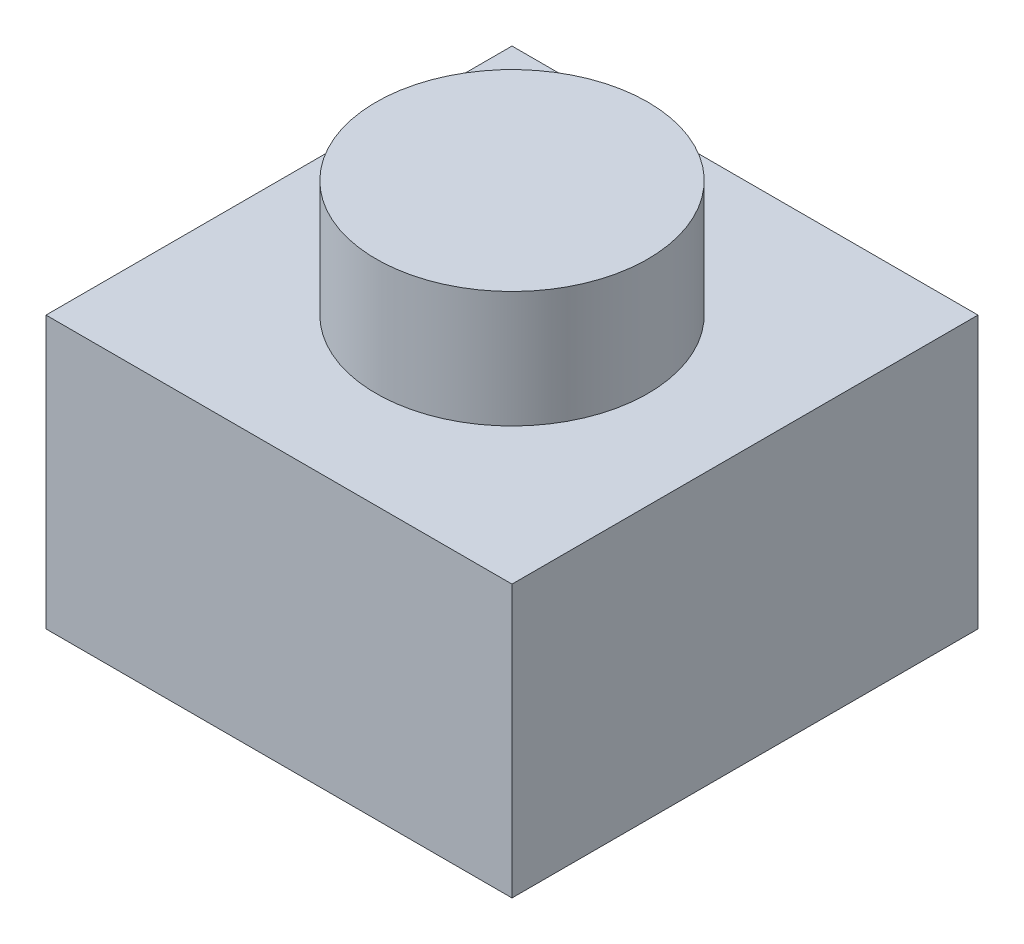
ISO-10303-21;
HEADER;
FILE_DESCRIPTION(('STEP AP214'),'2;1');
FILE_NAME('part.step','',(''),(''),'','','');
FILE_SCHEMA(('AUTOMOTIVE_DESIGN { 1 0 10303 214 1 1 1 1 }'));
ENDSEC;
DATA;
#1=APPLICATION_CONTEXT('core data for automotive mechanical design processes');
#2=APPLICATION_PROTOCOL_DEFINITION('international standard','automotive_design',2000,#1);
#3=PRODUCT_CONTEXT('',#1,'mechanical');
#4=PRODUCT('Part','Part','',(#3));
#5=PRODUCT_RELATED_PRODUCT_CATEGORY('part','',(#4));
#6=PRODUCT_DEFINITION_FORMATION('','',#4);
#7=PRODUCT_DEFINITION_CONTEXT('part definition',#1,'design');
#8=PRODUCT_DEFINITION('design','',#6,#7);
#9=PRODUCT_DEFINITION_SHAPE('','',#8);
#10=(LENGTH_UNIT() NAMED_UNIT(*) SI_UNIT(.MILLI.,.METRE.));
#11=(NAMED_UNIT(*) PLANE_ANGLE_UNIT() SI_UNIT($,.RADIAN.));
#12=(NAMED_UNIT(*) SI_UNIT($,.STERADIAN.) SOLID_ANGLE_UNIT());
#13=UNCERTAINTY_MEASURE_WITH_UNIT(LENGTH_MEASURE(1.E-05),#10,'distance_accuracy_value','');
#14=(GEOMETRIC_REPRESENTATION_CONTEXT(3) GLOBAL_UNCERTAINTY_ASSIGNED_CONTEXT((#13)) GLOBAL_UNIT_ASSIGNED_CONTEXT((#10,
#11,#12)) REPRESENTATION_CONTEXT('',''));
#15=CARTESIAN_POINT('',(0.,0.,0.));
#16=DIRECTION('',(0.,0.,1.));
#17=DIRECTION('',(1.,0.,0.));
#18=AXIS2_PLACEMENT_3D('',#15,#16,#17);
#19=CARTESIAN_POINT('',(0.,3.556,0.));
#20=DIRECTION('',(1.,0.,0.));
#21=DIRECTION('',(0.,0.,-1.));
#22=AXIS2_PLACEMENT_3D('',#19,#20,#21);
#23=PLANE('',#22);
#24=DIRECTION('',(0.,0.,1.));
#25=VECTOR('',#24,1.);
#26=CARTESIAN_POINT('',(0.,0.,0.));
#27=LINE('',#26,#25);
#28=CARTESIAN_POINT('',(0.,0.,-6.096));
#29=VERTEX_POINT('',#28);
#30=CARTESIAN_POINT('',(0.,0.,0.));
#31=VERTEX_POINT('',#30);
#32=EDGE_CURVE('E99',#29,#31,#27,.T.);
#33=ORIENTED_EDGE('',*,*,#32,.T.);
#34=DIRECTION('',(0.,-1.,0.));
#35=VECTOR('',#34,1.);
#36=CARTESIAN_POINT('',(0.,3.556,0.));
#37=LINE('',#36,#35);
#38=CARTESIAN_POINT('',(0.,3.556,0.));
#39=VERTEX_POINT('',#38);
#40=EDGE_CURVE('E36',#39,#31,#37,.T.);
#41=ORIENTED_EDGE('',*,*,#40,.F.);
#42=DIRECTION('',(0.,0.,1.));
#43=VECTOR('',#42,1.);
#44=CARTESIAN_POINT('',(0.,3.556,0.));
#45=LINE('',#44,#43);
#46=CARTESIAN_POINT('',(0.,3.556,-6.096));
#47=VERTEX_POINT('',#46);
#48=EDGE_CURVE('E86',#47,#39,#45,.T.);
#49=ORIENTED_EDGE('',*,*,#48,.F.);
#50=DIRECTION('',(0.,-1.,0.));
#51=VECTOR('',#50,1.);
#52=CARTESIAN_POINT('',(0.,3.556,-6.096));
#53=LINE('',#52,#51);
#54=EDGE_CURVE('E95',#47,#29,#53,.T.);
#55=ORIENTED_EDGE('',*,*,#54,.T.);
#56=EDGE_LOOP('',(#33,#41,#49,#55));
#57=FACE_BOUND('',#56,.T.);
#58=ADVANCED_FACE('F33',(#57),#23,.F.);
#59=CARTESIAN_POINT('',(0.,3.556,0.));
#60=DIRECTION('',(0.,0.,-1.));
#61=DIRECTION('',(-1.,0.,0.));
#62=AXIS2_PLACEMENT_3D('',#59,#60,#61);
#63=PLANE('',#62);
#64=DIRECTION('',(1.,0.,0.));
#65=VECTOR('',#64,1.);
#66=CARTESIAN_POINT('',(0.,0.,0.));
#67=LINE('',#66,#65);
#68=CARTESIAN_POINT('',(6.096,0.,0.));
#69=VERTEX_POINT('',#68);
#70=EDGE_CURVE('E91',#31,#69,#67,.T.);
#71=ORIENTED_EDGE('',*,*,#70,.T.);
#72=DIRECTION('',(0.,-1.,0.));
#73=VECTOR('',#72,1.);
#74=CARTESIAN_POINT('',(6.096,3.556,0.));
#75=LINE('',#74,#73);
#76=CARTESIAN_POINT('',(6.096,3.556,0.));
#77=VERTEX_POINT('',#76);
#78=EDGE_CURVE('E89',#77,#69,#75,.T.);
#79=ORIENTED_EDGE('',*,*,#78,.F.);
#80=DIRECTION('',(1.,0.,0.));
#81=VECTOR('',#80,1.);
#82=CARTESIAN_POINT('',(0.,3.556,0.));
#83=LINE('',#82,#81);
#84=EDGE_CURVE('E81',#39,#77,#83,.T.);
#85=ORIENTED_EDGE('',*,*,#84,.F.);
#86=ORIENTED_EDGE('',*,*,#40,.T.);
#87=EDGE_LOOP('',(#71,#79,#85,#86));
#88=FACE_BOUND('',#87,.T.);
#89=ADVANCED_FACE('F90',(#88),#63,.F.);
#90=CARTESIAN_POINT('',(6.096,3.556,0.));
#91=DIRECTION('',(-1.,0.,0.));
#92=DIRECTION('',(0.,0.,1.));
#93=AXIS2_PLACEMENT_3D('',#90,#91,#92);
#94=PLANE('',#93);
#95=DIRECTION('',(0.,0.,-1.));
#96=VECTOR('',#95,1.);
#97=CARTESIAN_POINT('',(6.096,0.,0.));
#98=LINE('',#97,#96);
#99=CARTESIAN_POINT('',(6.096,0.,-6.096));
#100=VERTEX_POINT('',#99);
#101=EDGE_CURVE('E67',#69,#100,#98,.T.);
#102=ORIENTED_EDGE('',*,*,#101,.T.);
#103=DIRECTION('',(0.,-1.,0.));
#104=VECTOR('',#103,1.);
#105=CARTESIAN_POINT('',(6.096,3.556,-6.096));
#106=LINE('',#105,#104);
#107=CARTESIAN_POINT('',(6.096,3.556,-6.096));
#108=VERTEX_POINT('',#107);
#109=EDGE_CURVE('E92',#108,#100,#106,.T.);
#110=ORIENTED_EDGE('',*,*,#109,.F.);
#111=DIRECTION('',(0.,0.,-1.));
#112=VECTOR('',#111,1.);
#113=CARTESIAN_POINT('',(6.096,3.556,0.));
#114=LINE('',#113,#112);
#115=EDGE_CURVE('E84',#77,#108,#114,.T.);
#116=ORIENTED_EDGE('',*,*,#115,.F.);
#117=ORIENTED_EDGE('',*,*,#78,.T.);
#118=EDGE_LOOP('',(#102,#110,#116,#117));
#119=FACE_BOUND('',#118,.T.);
#120=ADVANCED_FACE('F93',(#119),#94,.F.);
#121=CARTESIAN_POINT('',(0.,3.556,-6.096));
#122=DIRECTION('',(0.,0.,1.));
#123=DIRECTION('',(1.,0.,0.));
#124=AXIS2_PLACEMENT_3D('',#121,#122,#123);
#125=PLANE('',#124);
#126=DIRECTION('',(-1.,0.,0.));
#127=VECTOR('',#126,1.);
#128=CARTESIAN_POINT('',(0.,0.,-6.096));
#129=LINE('',#128,#127);
#130=EDGE_CURVE('E73',#100,#29,#129,.T.);
#131=ORIENTED_EDGE('',*,*,#130,.T.);
#132=ORIENTED_EDGE('',*,*,#54,.F.);
#133=DIRECTION('',(-1.,0.,0.));
#134=VECTOR('',#133,1.);
#135=CARTESIAN_POINT('',(0.,3.556,-6.096));
#136=LINE('',#135,#134);
#137=EDGE_CURVE('E50',#108,#47,#136,.T.);
#138=ORIENTED_EDGE('',*,*,#137,.F.);
#139=ORIENTED_EDGE('',*,*,#109,.T.);
#140=EDGE_LOOP('',(#131,#132,#138,#139));
#141=FACE_BOUND('',#140,.T.);
#142=ADVANCED_FACE('F107',(#141),#125,.F.);
#143=CARTESIAN_POINT('',(0.,3.556,0.));
#144=DIRECTION('',(0.,-1.,0.));
#145=DIRECTION('',(0.,0.,-1.));
#146=AXIS2_PLACEMENT_3D('',#143,#144,#145);
#147=PLANE('',#146);
#148=CARTESIAN_POINT('',(3.04800000000007,3.556,-3.048));
#149=DIRECTION('',(0.,1.,0.));
#150=DIRECTION('',(0.,0.,1.));
#151=AXIS2_PLACEMENT_3D('',#148,#149,#150);
#152=CIRCLE('',#151,1.778);
#153=CARTESIAN_POINT('',(3.04800000000007,3.556,-4.826));
#154=VERTEX_POINT('',#153);
#155=EDGE_CURVE('E11',#154,#154,#152,.T.);
#156=ORIENTED_EDGE('',*,*,#155,.F.);
#157=EDGE_LOOP('',(#156));
#158=FACE_BOUND('',#157,.T.);
#159=ORIENTED_EDGE('',*,*,#48,.T.);
#160=ORIENTED_EDGE('',*,*,#84,.T.);
#161=ORIENTED_EDGE('',*,*,#115,.T.);
#162=ORIENTED_EDGE('',*,*,#137,.T.);
#163=EDGE_LOOP('',(#159,#160,#161,#162));
#164=FACE_BOUND('',#163,.T.);
#165=ADVANCED_FACE('F82',(#158,#164),#147,.F.);
#166=CARTESIAN_POINT('',(0.,0.,0.));
#167=DIRECTION('',(0.,-1.,0.));
#168=DIRECTION('',(0.,0.,-1.));
#169=AXIS2_PLACEMENT_3D('',#166,#167,#168);
#170=PLANE('',#169);
#171=ORIENTED_EDGE('',*,*,#32,.F.);
#172=ORIENTED_EDGE('',*,*,#130,.F.);
#173=ORIENTED_EDGE('',*,*,#101,.F.);
#174=ORIENTED_EDGE('',*,*,#70,.F.);
#175=EDGE_LOOP('',(#171,#172,#173,#174));
#176=FACE_BOUND('',#175,.T.);
#177=ADVANCED_FACE('F110',(#176),#170,.T.);
#178=CARTESIAN_POINT('',(3.04800000000007,5.08,-3.048));
#179=DIRECTION('',(0.,-1.,0.));
#180=DIRECTION('',(0.,0.,-1.));
#181=AXIS2_PLACEMENT_3D('',#178,#179,#180);
#182=CYLINDRICAL_SURFACE('',#181,1.778);
#183=CARTESIAN_POINT('',(3.04800000000007,5.08,-3.048));
#184=DIRECTION('',(0.,1.,0.));
#185=DIRECTION('',(0.,0.,1.));
#186=AXIS2_PLACEMENT_3D('',#183,#184,#185);
#187=CIRCLE('',#186,1.778);
#188=CARTESIAN_POINT('',(3.04800000000007,5.08,-4.826));
#189=VERTEX_POINT('',#188);
#190=EDGE_CURVE('E102',#189,#189,#187,.T.);
#191=CARTESIAN_POINT('',(3.04800000000007,5.08,-4.826));
#192=CARTESIAN_POINT('',(3.04800000000007,5.064125,-4.826));
#193=CARTESIAN_POINT('',(3.04800000000007,5.04825,-4.826));
#194=CARTESIAN_POINT('',(3.04800000000007,5.0165,-4.826));
#195=CARTESIAN_POINT('',(3.04800000000007,5.000625,-4.826));
#196=CARTESIAN_POINT('',(3.04800000000007,4.968875,-4.826));
#197=CARTESIAN_POINT('',(3.04800000000007,4.953,-4.826));
#198=CARTESIAN_POINT('',(3.04800000000007,4.92125,-4.826));
#199=CARTESIAN_POINT('',(3.04800000000007,4.905375,-4.826));
#200=CARTESIAN_POINT('',(3.04800000000007,4.873625,-4.826));
#201=CARTESIAN_POINT('',(3.04800000000007,4.85775,-4.826));
#202=CARTESIAN_POINT('',(3.04800000000007,4.826,-4.826));
#203=CARTESIAN_POINT('',(3.04800000000007,4.810125,-4.826));
#204=CARTESIAN_POINT('',(3.04800000000007,4.778375,-4.826));
#205=CARTESIAN_POINT('',(3.04800000000007,4.7625,-4.826));
#206=CARTESIAN_POINT('',(3.04800000000007,4.73075,-4.826));
#207=CARTESIAN_POINT('',(3.04800000000007,4.714875,-4.826));
#208=CARTESIAN_POINT('',(3.04800000000007,4.683125,-4.826));
#209=CARTESIAN_POINT('',(3.04800000000007,4.66725,-4.826));
#210=CARTESIAN_POINT('',(3.04800000000007,4.6355,-4.826));
#211=CARTESIAN_POINT('',(3.04800000000007,4.619625,-4.826));
#212=CARTESIAN_POINT('',(3.04800000000007,4.587875,-4.826));
#213=CARTESIAN_POINT('',(3.04800000000007,4.572,-4.826));
#214=CARTESIAN_POINT('',(3.04800000000007,4.54025,-4.826));
#215=CARTESIAN_POINT('',(3.04800000000007,4.524375,-4.826));
#216=CARTESIAN_POINT('',(3.04800000000007,4.492625,-4.826));
#217=CARTESIAN_POINT('',(3.04800000000007,4.47675,-4.826));
#218=CARTESIAN_POINT('',(3.04800000000007,4.445,-4.826));
#219=CARTESIAN_POINT('',(3.04800000000007,4.429125,-4.826));
#220=CARTESIAN_POINT('',(3.04800000000007,4.397375,-4.826));
#221=CARTESIAN_POINT('',(3.04800000000007,4.3815,-4.826));
#222=CARTESIAN_POINT('',(3.04800000000007,4.34975,-4.826));
#223=CARTESIAN_POINT('',(3.04800000000007,4.333875,-4.826));
#224=CARTESIAN_POINT('',(3.04800000000007,4.302125,-4.826));
#225=CARTESIAN_POINT('',(3.04800000000007,4.28625,-4.826));
#226=CARTESIAN_POINT('',(3.04800000000007,4.2545,-4.826));
#227=CARTESIAN_POINT('',(3.04800000000007,4.238625,-4.826));
#228=CARTESIAN_POINT('',(3.04800000000007,4.206875,-4.826));
#229=CARTESIAN_POINT('',(3.04800000000007,4.191,-4.826));
#230=CARTESIAN_POINT('',(3.04800000000007,4.15925,-4.826));
#231=CARTESIAN_POINT('',(3.04800000000007,4.143375,-4.826));
#232=CARTESIAN_POINT('',(3.04800000000007,4.111625,-4.826));
#233=CARTESIAN_POINT('',(3.04800000000007,4.09575,-4.826));
#234=CARTESIAN_POINT('',(3.04800000000007,4.064,-4.826));
#235=CARTESIAN_POINT('',(3.04800000000007,4.048125,-4.826));
#236=CARTESIAN_POINT('',(3.04800000000007,4.016375,-4.826));
#237=CARTESIAN_POINT('',(3.04800000000007,4.0005,-4.826));
#238=CARTESIAN_POINT('',(3.04800000000007,3.96875,-4.826));
#239=CARTESIAN_POINT('',(3.04800000000007,3.952875,-4.826));
#240=CARTESIAN_POINT('',(3.04800000000007,3.921125,-4.826));
#241=CARTESIAN_POINT('',(3.04800000000007,3.90525,-4.826));
#242=CARTESIAN_POINT('',(3.04800000000007,3.8735,-4.826));
#243=CARTESIAN_POINT('',(3.04800000000007,3.857625,-4.826));
#244=CARTESIAN_POINT('',(3.04800000000007,3.825875,-4.826));
#245=CARTESIAN_POINT('',(3.04800000000007,3.81,-4.826));
#246=CARTESIAN_POINT('',(3.04800000000007,3.77825,-4.826));
#247=CARTESIAN_POINT('',(3.04800000000007,3.762375,-4.826));
#248=CARTESIAN_POINT('',(3.04800000000007,3.730625,-4.826));
#249=CARTESIAN_POINT('',(3.04800000000007,3.71475,-4.826));
#250=CARTESIAN_POINT('',(3.04800000000007,3.683,-4.826));
#251=CARTESIAN_POINT('',(3.04800000000007,3.667125,-4.826));
#252=CARTESIAN_POINT('',(3.04800000000007,3.635375,-4.826));
#253=CARTESIAN_POINT('',(3.04800000000007,3.6195,-4.826));
#254=CARTESIAN_POINT('',(3.04800000000007,3.58775,-4.826));
#255=CARTESIAN_POINT('',(3.04800000000007,3.571875,-4.826));
#256=CARTESIAN_POINT('',(3.04800000000007,3.556,-4.826));
#257=B_SPLINE_CURVE_WITH_KNOTS('',3,(#191,#192,#193,#194,#195,#196,#197,#198,#199,#200,#201,
#202,#203,#204,#205,#206,#207,#208,#209,#210,#211,#212,#213,#214,#215,#216,#217,#218,#219,#220,
#221,#222,#223,#224,#225,#226,#227,#228,#229,#230,#231,#232,#233,#234,#235,#236,#237,#238,#239,
#240,#241,#242,#243,#244,#245,#246,#247,#248,#249,#250,#251,#252,#253,#254,#255,#256),
.UNSPECIFIED.,.F.,.F.,(4,2,2,2,2,2,2,2,2,2,2,2,2,2,2,2,2,2,2,2,2,2,2,2,2,2,2,2,2,2,2,2,4),(0.,
0.0476249999999999,0.0952499999999998,0.142875,0.1905,0.238125,0.28575,0.333374999999999,
0.380999999999999,0.428624999999999,0.476249999999999,0.523874999999999,0.571499999999999,
0.619125,0.66675,0.714375,0.762,0.809625,0.85725,0.904874999999999,0.952499999999999,1.000125,
1.04775,1.095375,1.143,1.190625,1.23825,1.285875,1.3335,1.381125,1.42875,1.476375,1.524),.UNSPECIFIED.);
#258=EDGE_CURVE('BSEAM118',#189,#154,#257,.T.);
#259=ORIENTED_EDGE('',*,*,#190,.F.);
#260=ORIENTED_EDGE('',*,*,#155,.T.);
#261=ORIENTED_EDGE('',*,*,#258,.T.);
#262=ORIENTED_EDGE('',*,*,#258,.F.);
#263=EDGE_LOOP('',(#259,#261,#260,#262));
#264=FACE_BOUND('',#263,.T.);
#265=ADVANCED_FACE('F118',(#264),#182,.T.);
#266=CARTESIAN_POINT('',(3.04800000000007,5.08,-3.048));
#267=DIRECTION('',(0.,1.,0.));
#268=DIRECTION('',(0.,0.,1.));
#269=AXIS2_PLACEMENT_3D('',#266,#267,#268);
#270=PLANE('',#269);
#271=ORIENTED_EDGE('',*,*,#190,.T.);
#272=EDGE_LOOP('',(#271));
#273=FACE_BOUND('',#272,.T.);
#274=ADVANCED_FACE('F116',(#273),#270,.T.);
#275=CLOSED_SHELL('',(#58,#89,#120,#142,#165,#177,#265,#274));
#276=MANIFOLD_SOLID_BREP('B2',#275);
#277=ADVANCED_BREP_SHAPE_REPRESENTATION('',(#18,#276),#14);
#278=SHAPE_DEFINITION_REPRESENTATION(#9,#277);
ENDSEC;
END-ISO-10303-21;
